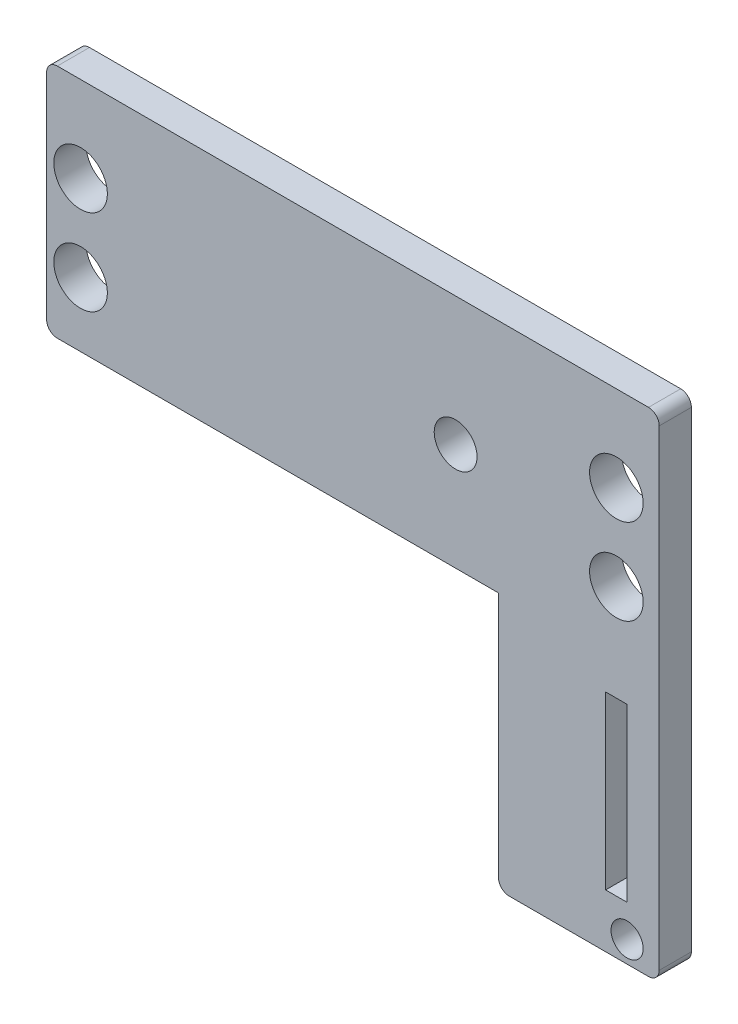
ISO-10303-21;
HEADER;
FILE_DESCRIPTION(('STEP AP214'),'2;1');
FILE_NAME('part.step','',(''),(''),'','','');
FILE_SCHEMA(('AUTOMOTIVE_DESIGN { 1 0 10303 214 1 1 1 1 }'));
ENDSEC;
DATA;
#1=APPLICATION_CONTEXT('core data for automotive mechanical design processes');
#2=APPLICATION_PROTOCOL_DEFINITION('international standard','automotive_design',2000,#1);
#3=PRODUCT_CONTEXT('',#1,'mechanical');
#4=PRODUCT('Part','Part','',(#3));
#5=PRODUCT_RELATED_PRODUCT_CATEGORY('part','',(#4));
#6=PRODUCT_DEFINITION_FORMATION('','',#4);
#7=PRODUCT_DEFINITION_CONTEXT('part definition',#1,'design');
#8=PRODUCT_DEFINITION('design','',#6,#7);
#9=PRODUCT_DEFINITION_SHAPE('','',#8);
#10=(LENGTH_UNIT() NAMED_UNIT(*) SI_UNIT(.MILLI.,.METRE.));
#11=(NAMED_UNIT(*) PLANE_ANGLE_UNIT() SI_UNIT($,.RADIAN.));
#12=(NAMED_UNIT(*) SI_UNIT($,.STERADIAN.) SOLID_ANGLE_UNIT());
#13=UNCERTAINTY_MEASURE_WITH_UNIT(LENGTH_MEASURE(1.E-05),#10,'distance_accuracy_value','');
#14=(GEOMETRIC_REPRESENTATION_CONTEXT(3) GLOBAL_UNCERTAINTY_ASSIGNED_CONTEXT((#13)) GLOBAL_UNIT_ASSIGNED_CONTEXT((#10,
#11,#12)) REPRESENTATION_CONTEXT('',''));
#15=CARTESIAN_POINT('',(0.,0.,0.));
#16=DIRECTION('',(0.,0.,1.));
#17=DIRECTION('',(1.,0.,0.));
#18=AXIS2_PLACEMENT_3D('',#15,#16,#17);
#19=CARTESIAN_POINT('',(1.,1.,0.));
#20=DIRECTION('',(0.,0.,1.));
#21=DIRECTION('',(1.,0.,0.));
#22=AXIS2_PLACEMENT_3D('',#19,#20,#21);
#23=CYLINDRICAL_SURFACE('',#22,1.);
#24=CARTESIAN_POINT('',(1.,1.,0.));
#25=DIRECTION('',(0.,0.,1.));
#26=DIRECTION('',(1.,0.,0.));
#27=AXIS2_PLACEMENT_3D('',#24,#25,#26);
#28=CIRCLE('',#27,1.);
#29=CARTESIAN_POINT('',(0.,1.,0.));
#30=VERTEX_POINT('',#29);
#31=CARTESIAN_POINT('',(1.,0.,0.));
#32=VERTEX_POINT('',#31);
#33=EDGE_CURVE('E265',#30,#32,#28,.T.);
#34=ORIENTED_EDGE('',*,*,#33,.T.);
#35=DIRECTION('',(0.,0.,-1.));
#36=VECTOR('',#35,1.);
#37=CARTESIAN_POINT('',(1.,0.,0.));
#38=LINE('',#37,#36);
#39=CARTESIAN_POINT('',(1.,0.,3.));
#40=VERTEX_POINT('',#39);
#41=EDGE_CURVE('E128',#40,#32,#38,.T.);
#42=ORIENTED_EDGE('',*,*,#41,.F.);
#43=CARTESIAN_POINT('',(1.,1.,3.));
#44=DIRECTION('',(0.,0.,1.));
#45=DIRECTION('',(1.,0.,0.));
#46=AXIS2_PLACEMENT_3D('',#43,#44,#45);
#47=CIRCLE('',#46,1.);
#48=CARTESIAN_POINT('',(0.,1.,3.));
#49=VERTEX_POINT('',#48);
#50=EDGE_CURVE('E20',#40,#49,#47,.F.);
#51=ORIENTED_EDGE('',*,*,#50,.T.);
#52=DIRECTION('',(0.,0.,1.));
#53=VECTOR('',#52,1.);
#54=CARTESIAN_POINT('',(0.,1.,0.));
#55=LINE('',#54,#53);
#56=EDGE_CURVE('E125',#30,#49,#55,.T.);
#57=ORIENTED_EDGE('',*,*,#56,.F.);
#58=EDGE_LOOP('',(#34,#42,#51,#57));
#59=FACE_BOUND('',#58,.T.);
#60=ADVANCED_FACE('F17',(#59),#23,.T.);
#61=CARTESIAN_POINT('',(14.,0.999999999999996,0.));
#62=DIRECTION('',(0.,0.,1.));
#63=DIRECTION('',(1.,0.,0.));
#64=AXIS2_PLACEMENT_3D('',#61,#62,#63);
#65=CYLINDRICAL_SURFACE('',#64,1.);
#66=CARTESIAN_POINT('',(14.,0.999999999999996,0.));
#67=DIRECTION('',(0.,0.,1.));
#68=DIRECTION('',(1.,0.,0.));
#69=AXIS2_PLACEMENT_3D('',#66,#67,#68);
#70=CIRCLE('',#69,1.);
#71=CARTESIAN_POINT('',(14.,0.,0.));
#72=VERTEX_POINT('',#71);
#73=CARTESIAN_POINT('',(15.,0.999999999999995,0.));
#74=VERTEX_POINT('',#73);
#75=EDGE_CURVE('E263',#72,#74,#70,.T.);
#76=ORIENTED_EDGE('',*,*,#75,.T.);
#77=DIRECTION('',(0.,0.,-1.));
#78=VECTOR('',#77,1.);
#79=CARTESIAN_POINT('',(15.,0.999999999999994,0.));
#80=LINE('',#79,#78);
#81=CARTESIAN_POINT('',(15.,0.999999999999995,3.));
#82=VERTEX_POINT('',#81);
#83=EDGE_CURVE('E194',#82,#74,#80,.T.);
#84=ORIENTED_EDGE('',*,*,#83,.F.);
#85=CARTESIAN_POINT('',(14.,0.999999999999996,3.));
#86=DIRECTION('',(0.,0.,1.));
#87=DIRECTION('',(1.,0.,0.));
#88=AXIS2_PLACEMENT_3D('',#85,#86,#87);
#89=CIRCLE('',#88,1.);
#90=CARTESIAN_POINT('',(14.,0.,3.));
#91=VERTEX_POINT('',#90);
#92=EDGE_CURVE('E130',#82,#91,#89,.F.);
#93=ORIENTED_EDGE('',*,*,#92,.T.);
#94=DIRECTION('',(0.,0.,-1.));
#95=VECTOR('',#94,1.);
#96=CARTESIAN_POINT('',(14.,0.,0.));
#97=LINE('',#96,#95);
#98=EDGE_CURVE('E202',#72,#91,#97,.F.);
#99=ORIENTED_EDGE('',*,*,#98,.F.);
#100=EDGE_LOOP('',(#76,#84,#93,#99));
#101=FACE_BOUND('',#100,.T.);
#102=ADVANCED_FACE('F274',(#101),#65,.T.);
#103=CARTESIAN_POINT('',(14.,45.,0.));
#104=DIRECTION('',(0.,0.,1.));
#105=DIRECTION('',(1.,0.,0.));
#106=AXIS2_PLACEMENT_3D('',#103,#104,#105);
#107=CYLINDRICAL_SURFACE('',#106,1.);
#108=CARTESIAN_POINT('',(14.,45.,0.));
#109=DIRECTION('',(0.,0.,1.));
#110=DIRECTION('',(1.,0.,0.));
#111=AXIS2_PLACEMENT_3D('',#108,#109,#110);
#112=CIRCLE('',#111,1.);
#113=CARTESIAN_POINT('',(15.,45.,0.));
#114=VERTEX_POINT('',#113);
#115=CARTESIAN_POINT('',(14.,46.,0.));
#116=VERTEX_POINT('',#115);
#117=EDGE_CURVE('E261',#114,#116,#112,.T.);
#118=ORIENTED_EDGE('',*,*,#117,.T.);
#119=DIRECTION('',(0.,0.,1.));
#120=VECTOR('',#119,1.);
#121=CARTESIAN_POINT('',(14.,46.,0.));
#122=LINE('',#121,#120);
#123=CARTESIAN_POINT('',(14.,46.,3.));
#124=VERTEX_POINT('',#123);
#125=EDGE_CURVE('E186',#124,#116,#122,.F.);
#126=ORIENTED_EDGE('',*,*,#125,.F.);
#127=CARTESIAN_POINT('',(14.,45.,3.));
#128=DIRECTION('',(0.,0.,1.));
#129=DIRECTION('',(1.,0.,0.));
#130=AXIS2_PLACEMENT_3D('',#127,#128,#129);
#131=CIRCLE('',#130,1.);
#132=CARTESIAN_POINT('',(15.,45.,3.));
#133=VERTEX_POINT('',#132);
#134=EDGE_CURVE('E271',#124,#133,#131,.F.);
#135=ORIENTED_EDGE('',*,*,#134,.T.);
#136=DIRECTION('',(0.,0.,-1.));
#137=VECTOR('',#136,1.);
#138=CARTESIAN_POINT('',(15.,45.,0.));
#139=LINE('',#138,#137);
#140=EDGE_CURVE('E197',#114,#133,#139,.F.);
#141=ORIENTED_EDGE('',*,*,#140,.F.);
#142=EDGE_LOOP('',(#118,#126,#135,#141));
#143=FACE_BOUND('',#142,.T.);
#144=ADVANCED_FACE('F392',(#143),#107,.T.);
#145=CARTESIAN_POINT('',(-41.1673508127766,45.,1.5));
#146=DIRECTION('',(0.,0.,1.));
#147=DIRECTION('',(1.,0.,0.));
#148=AXIS2_PLACEMENT_3D('',#145,#146,#147);
#149=CYLINDRICAL_SURFACE('',#148,1.);
#150=CARTESIAN_POINT('',(-41.1673508127766,45.,0.));
#151=DIRECTION('',(0.,0.,1.));
#152=DIRECTION('',(1.,0.,0.));
#153=AXIS2_PLACEMENT_3D('',#150,#151,#152);
#154=CIRCLE('',#153,1.);
#155=CARTESIAN_POINT('',(-41.1673508127766,46.,0.));
#156=VERTEX_POINT('',#155);
#157=CARTESIAN_POINT('',(-42.1673508127766,45.,0.));
#158=VERTEX_POINT('',#157);
#159=EDGE_CURVE('E259',#156,#158,#154,.T.);
#160=ORIENTED_EDGE('',*,*,#159,.T.);
#161=DIRECTION('',(0.,0.,-1.));
#162=VECTOR('',#161,1.);
#163=CARTESIAN_POINT('',(-42.1673508127766,45.,3.));
#164=LINE('',#163,#162);
#165=CARTESIAN_POINT('',(-42.1673508127766,45.,3.));
#166=VERTEX_POINT('',#165);
#167=EDGE_CURVE('E178',#158,#166,#164,.F.);
#168=ORIENTED_EDGE('',*,*,#167,.T.);
#169=CARTESIAN_POINT('',(-41.1673508127766,45.,3.));
#170=DIRECTION('',(0.,0.,1.));
#171=DIRECTION('',(1.,0.,0.));
#172=AXIS2_PLACEMENT_3D('',#169,#170,#171);
#173=CIRCLE('',#172,1.);
#174=CARTESIAN_POINT('',(-41.1673508127766,46.,3.));
#175=VERTEX_POINT('',#174);
#176=EDGE_CURVE('E269',#166,#175,#173,.F.);
#177=ORIENTED_EDGE('',*,*,#176,.T.);
#178=DIRECTION('',(0.,0.,1.));
#179=VECTOR('',#178,1.);
#180=CARTESIAN_POINT('',(-41.1673508127766,46.,0.));
#181=LINE('',#180,#179);
#182=EDGE_CURVE('E190',#156,#175,#181,.T.);
#183=ORIENTED_EDGE('',*,*,#182,.F.);
#184=EDGE_LOOP('',(#160,#168,#177,#183));
#185=FACE_BOUND('',#184,.T.);
#186=ADVANCED_FACE('F388',(#185),#149,.T.);
#187=CARTESIAN_POINT('',(-41.1673508127766,25.,1.5));
#188=DIRECTION('',(0.,0.,-1.));
#189=DIRECTION('',(-1.,0.,0.));
#190=AXIS2_PLACEMENT_3D('',#187,#188,#189);
#191=CYLINDRICAL_SURFACE('',#190,1.);
#192=CARTESIAN_POINT('',(-41.1673508127766,25.,3.));
#193=DIRECTION('',(0.,0.,-1.));
#194=DIRECTION('',(-1.,0.,0.));
#195=AXIS2_PLACEMENT_3D('',#192,#193,#194);
#196=CIRCLE('',#195,1.);
#197=CARTESIAN_POINT('',(-41.1673508127766,24.,3.));
#198=VERTEX_POINT('',#197);
#199=CARTESIAN_POINT('',(-42.1673508127766,25.,3.));
#200=VERTEX_POINT('',#199);
#201=EDGE_CURVE('E267',#198,#200,#196,.T.);
#202=ORIENTED_EDGE('',*,*,#201,.T.);
#203=DIRECTION('',(0.,0.,-1.));
#204=VECTOR('',#203,1.);
#205=CARTESIAN_POINT('',(-42.1673508127766,25.,3.));
#206=LINE('',#205,#204);
#207=CARTESIAN_POINT('',(-42.1673508127766,25.,0.));
#208=VERTEX_POINT('',#207);
#209=EDGE_CURVE('E181',#200,#208,#206,.T.);
#210=ORIENTED_EDGE('',*,*,#209,.T.);
#211=CARTESIAN_POINT('',(-41.1673508127766,25.,0.));
#212=DIRECTION('',(0.,0.,-1.));
#213=DIRECTION('',(-1.,0.,0.));
#214=AXIS2_PLACEMENT_3D('',#211,#212,#213);
#215=CIRCLE('',#214,1.);
#216=CARTESIAN_POINT('',(-41.1673508127766,24.,0.));
#217=VERTEX_POINT('',#216);
#218=EDGE_CURVE('E211',#208,#217,#215,.F.);
#219=ORIENTED_EDGE('',*,*,#218,.T.);
#220=DIRECTION('',(0.,0.,-1.));
#221=VECTOR('',#220,1.);
#222=CARTESIAN_POINT('',(-41.1673508127766,24.,0.));
#223=LINE('',#222,#221);
#224=EDGE_CURVE('E208',#198,#217,#223,.T.);
#225=ORIENTED_EDGE('',*,*,#224,.F.);
#226=EDGE_LOOP('',(#202,#210,#219,#225));
#227=FACE_BOUND('',#226,.T.);
#228=ADVANCED_FACE('F342',(#227),#191,.T.);
#229=CARTESIAN_POINT('',(-12.5357142857143,28.4642857142857,0.));
#230=DIRECTION('',(0.,0.,1.));
#231=DIRECTION('',(1.,0.,0.));
#232=AXIS2_PLACEMENT_3D('',#229,#230,#231);
#233=PLANE('',#232);
#234=CARTESIAN_POINT('',(12.,2.,0.));
#235=DIRECTION('',(0.,0.,-1.));
#236=DIRECTION('',(-1.,0.,0.));
#237=AXIS2_PLACEMENT_3D('',#234,#235,#236);
#238=CIRCLE('',#237,1.5);
#239=CARTESIAN_POINT('',(10.5,2.,0.));
#240=VERTEX_POINT('',#239);
#241=EDGE_CURVE('E150',#240,#240,#238,.F.);
#242=ORIENTED_EDGE('',*,*,#241,.T.);
#243=EDGE_LOOP('',(#242));
#244=FACE_BOUND('',#243,.T.);
#245=DIRECTION('',(0.,1.,0.));
#246=VECTOR('',#245,1.);
#247=CARTESIAN_POINT('',(10.,21.,0.));
#248=LINE('',#247,#246);
#249=CARTESIAN_POINT('',(10.,21.,0.));
#250=VERTEX_POINT('',#249);
#251=CARTESIAN_POINT('',(10.,5.,0.));
#252=VERTEX_POINT('',#251);
#253=EDGE_CURVE('E158',#250,#252,#248,.F.);
#254=ORIENTED_EDGE('',*,*,#253,.T.);
#255=DIRECTION('',(1.,0.,0.));
#256=VECTOR('',#255,1.);
#257=CARTESIAN_POINT('',(10.,5.,0.));
#258=LINE('',#257,#256);
#259=CARTESIAN_POINT('',(12.,5.,0.));
#260=VERTEX_POINT('',#259);
#261=EDGE_CURVE('E165',#252,#260,#258,.T.);
#262=ORIENTED_EDGE('',*,*,#261,.T.);
#263=DIRECTION('',(0.,1.,0.));
#264=VECTOR('',#263,1.);
#265=CARTESIAN_POINT('',(12.,5.,0.));
#266=LINE('',#265,#264);
#267=CARTESIAN_POINT('',(12.,21.,0.));
#268=VERTEX_POINT('',#267);
#269=EDGE_CURVE('E170',#260,#268,#266,.T.);
#270=ORIENTED_EDGE('',*,*,#269,.T.);
#271=DIRECTION('',(1.,0.,0.));
#272=VECTOR('',#271,1.);
#273=CARTESIAN_POINT('',(12.,21.,0.));
#274=LINE('',#273,#272);
#275=EDGE_CURVE('E175',#268,#250,#274,.F.);
#276=ORIENTED_EDGE('',*,*,#275,.T.);
#277=EDGE_LOOP('',(#254,#262,#270,#276));
#278=FACE_BOUND('',#277,.T.);
#279=CARTESIAN_POINT('',(-39.,30.,0.));
#280=DIRECTION('',(0.,0.,-1.));
#281=DIRECTION('',(-1.,0.,0.));
#282=AXIS2_PLACEMENT_3D('',#279,#280,#281);
#283=CIRCLE('',#282,2.5);
#284=CARTESIAN_POINT('',(-41.5,30.,0.));
#285=VERTEX_POINT('',#284);
#286=EDGE_CURVE('E177',#285,#285,#283,.F.);
#287=ORIENTED_EDGE('',*,*,#286,.T.);
#288=EDGE_LOOP('',(#287));
#289=FACE_BOUND('',#288,.T.);
#290=CARTESIAN_POINT('',(11.,30.,0.));
#291=DIRECTION('',(0.,0.,-1.));
#292=DIRECTION('',(-1.,0.,0.));
#293=AXIS2_PLACEMENT_3D('',#290,#291,#292);
#294=CIRCLE('',#293,2.5);
#295=CARTESIAN_POINT('',(8.49999999999999,30.,0.));
#296=VERTEX_POINT('',#295);
#297=EDGE_CURVE('E247',#296,#296,#294,.F.);
#298=ORIENTED_EDGE('',*,*,#297,.T.);
#299=EDGE_LOOP('',(#298));
#300=FACE_BOUND('',#299,.T.);
#301=CARTESIAN_POINT('',(-39.,38.0000000000001,0.));
#302=DIRECTION('',(0.,0.,-1.));
#303=DIRECTION('',(-1.,0.,0.));
#304=AXIS2_PLACEMENT_3D('',#301,#302,#303);
#305=CIRCLE('',#304,2.5);
#306=CARTESIAN_POINT('',(-41.5,38.0000000000001,0.));
#307=VERTEX_POINT('',#306);
#308=EDGE_CURVE('E250',#307,#307,#305,.F.);
#309=ORIENTED_EDGE('',*,*,#308,.T.);
#310=EDGE_LOOP('',(#309));
#311=FACE_BOUND('',#310,.T.);
#312=CARTESIAN_POINT('',(11.,38.,0.));
#313=DIRECTION('',(0.,0.,-1.));
#314=DIRECTION('',(-1.,0.,0.));
#315=AXIS2_PLACEMENT_3D('',#312,#313,#314);
#316=CIRCLE('',#315,2.5);
#317=CARTESIAN_POINT('',(8.49999999999996,38.,0.));
#318=VERTEX_POINT('',#317);
#319=EDGE_CURVE('E253',#318,#318,#316,.F.);
#320=ORIENTED_EDGE('',*,*,#319,.T.);
#321=EDGE_LOOP('',(#320));
#322=FACE_BOUND('',#321,.T.);
#323=CARTESIAN_POINT('',(-3.99999999999999,34.,0.));
#324=DIRECTION('',(0.,0.,-1.));
#325=DIRECTION('',(-1.,0.,0.));
#326=AXIS2_PLACEMENT_3D('',#323,#324,#325);
#327=CIRCLE('',#326,2.);
#328=CARTESIAN_POINT('',(-5.99999999999999,34.,0.));
#329=VERTEX_POINT('',#328);
#330=EDGE_CURVE('E185',#329,#329,#327,.F.);
#331=ORIENTED_EDGE('',*,*,#330,.T.);
#332=EDGE_LOOP('',(#331));
#333=FACE_BOUND('',#332,.T.);
#334=DIRECTION('',(0.,1.,0.));
#335=VECTOR('',#334,1.);
#336=CARTESIAN_POINT('',(-42.1673508127766,24.,0.));
#337=LINE('',#336,#335);
#338=EDGE_CURVE('E182',#208,#158,#337,.T.);
#339=ORIENTED_EDGE('',*,*,#338,.T.);
#340=ORIENTED_EDGE('',*,*,#159,.F.);
#341=DIRECTION('',(1.,0.,0.));
#342=VECTOR('',#341,1.);
#343=CARTESIAN_POINT('',(-20.,46.,0.));
#344=LINE('',#343,#342);
#345=EDGE_CURVE('E189',#116,#156,#344,.F.);
#346=ORIENTED_EDGE('',*,*,#345,.F.);
#347=ORIENTED_EDGE('',*,*,#117,.F.);
#348=DIRECTION('',(0.,1.,0.));
#349=VECTOR('',#348,1.);
#350=CARTESIAN_POINT('',(15.,46.,0.));
#351=LINE('',#350,#349);
#352=EDGE_CURVE('E193',#74,#114,#351,.T.);
#353=ORIENTED_EDGE('',*,*,#352,.F.);
#354=ORIENTED_EDGE('',*,*,#75,.F.);
#355=DIRECTION('',(1.,0.,0.));
#356=VECTOR('',#355,1.);
#357=CARTESIAN_POINT('',(15.,0.,0.));
#358=LINE('',#357,#356);
#359=EDGE_CURVE('E200',#32,#72,#358,.T.);
#360=ORIENTED_EDGE('',*,*,#359,.F.);
#361=ORIENTED_EDGE('',*,*,#33,.F.);
#362=DIRECTION('',(0.,1.,0.));
#363=VECTOR('',#362,1.);
#364=CARTESIAN_POINT('',(0.,0.,0.));
#365=LINE('',#364,#363);
#366=CARTESIAN_POINT('',(0.,24.,0.));
#367=VERTEX_POINT('',#366);
#368=EDGE_CURVE('E139',#367,#30,#365,.F.);
#369=ORIENTED_EDGE('',*,*,#368,.F.);
#370=DIRECTION('',(1.,0.,0.));
#371=VECTOR('',#370,1.);
#372=CARTESIAN_POINT('',(0.,24.,0.));
#373=LINE('',#372,#371);
#374=EDGE_CURVE('E141',#217,#367,#373,.T.);
#375=ORIENTED_EDGE('',*,*,#374,.F.);
#376=ORIENTED_EDGE('',*,*,#218,.F.);
#377=EDGE_LOOP('',(#339,#340,#346,#347,#353,#354,#360,#361,#369,#375,#376));
#378=FACE_BOUND('',#377,.T.);
#379=ADVANCED_FACE('F282',(#244,#278,#289,#300,#311,#322,#333,#378),#233,.F.);
#380=CARTESIAN_POINT('',(0.,24.,0.));
#381=DIRECTION('',(0.,-1.,0.));
#382=DIRECTION('',(0.,0.,-1.));
#383=AXIS2_PLACEMENT_3D('',#380,#381,#382);
#384=PLANE('',#383);
#385=DIRECTION('',(0.,0.,1.));
#386=VECTOR('',#385,1.);
#387=CARTESIAN_POINT('',(0.,24.,0.));
#388=LINE('',#387,#386);
#389=CARTESIAN_POINT('',(0.,24.,3.));
#390=VERTEX_POINT('',#389);
#391=EDGE_CURVE('E140',#390,#367,#388,.F.);
#392=ORIENTED_EDGE('',*,*,#391,.F.);
#393=DIRECTION('',(1.,0.,0.));
#394=VECTOR('',#393,1.);
#395=CARTESIAN_POINT('',(-12.5357142857143,24.,3.));
#396=LINE('',#395,#394);
#397=EDGE_CURVE('E145',#198,#390,#396,.T.);
#398=ORIENTED_EDGE('',*,*,#397,.F.);
#399=ORIENTED_EDGE('',*,*,#224,.T.);
#400=ORIENTED_EDGE('',*,*,#374,.T.);
#401=EDGE_LOOP('',(#392,#398,#399,#400));
#402=FACE_BOUND('',#401,.T.);
#403=ADVANCED_FACE('F341',(#402),#384,.T.);
#404=CARTESIAN_POINT('',(0.,0.,0.));
#405=DIRECTION('',(-1.,0.,0.));
#406=DIRECTION('',(0.,0.,1.));
#407=AXIS2_PLACEMENT_3D('',#404,#405,#406);
#408=PLANE('',#407);
#409=ORIENTED_EDGE('',*,*,#391,.T.);
#410=ORIENTED_EDGE('',*,*,#368,.T.);
#411=ORIENTED_EDGE('',*,*,#56,.T.);
#412=DIRECTION('',(0.,1.,0.));
#413=VECTOR('',#412,1.);
#414=CARTESIAN_POINT('',(0.,28.4642857142857,3.));
#415=LINE('',#414,#413);
#416=EDGE_CURVE('E136',#390,#49,#415,.F.);
#417=ORIENTED_EDGE('',*,*,#416,.F.);
#418=EDGE_LOOP('',(#409,#410,#411,#417));
#419=FACE_BOUND('',#418,.T.);
#420=ADVANCED_FACE('F135',(#419),#408,.T.);
#421=CARTESIAN_POINT('',(15.,0.,0.));
#422=DIRECTION('',(0.,-1.,0.));
#423=DIRECTION('',(0.,0.,-1.));
#424=AXIS2_PLACEMENT_3D('',#421,#422,#423);
#425=PLANE('',#424);
#426=ORIENTED_EDGE('',*,*,#41,.T.);
#427=ORIENTED_EDGE('',*,*,#359,.T.);
#428=ORIENTED_EDGE('',*,*,#98,.T.);
#429=DIRECTION('',(1.,0.,0.));
#430=VECTOR('',#429,1.);
#431=CARTESIAN_POINT('',(-12.5357142857143,0.,3.));
#432=LINE('',#431,#430);
#433=EDGE_CURVE('E146',#40,#91,#432,.T.);
#434=ORIENTED_EDGE('',*,*,#433,.F.);
#435=EDGE_LOOP('',(#426,#427,#428,#434));
#436=FACE_BOUND('',#435,.T.);
#437=ADVANCED_FACE('F279',(#436),#425,.T.);
#438=CARTESIAN_POINT('',(15.,46.,0.));
#439=DIRECTION('',(1.,0.,0.));
#440=DIRECTION('',(0.,0.,-1.));
#441=AXIS2_PLACEMENT_3D('',#438,#439,#440);
#442=PLANE('',#441);
#443=ORIENTED_EDGE('',*,*,#83,.T.);
#444=ORIENTED_EDGE('',*,*,#352,.T.);
#445=ORIENTED_EDGE('',*,*,#140,.T.);
#446=DIRECTION('',(0.,1.,0.));
#447=VECTOR('',#446,1.);
#448=CARTESIAN_POINT('',(15.,28.4642857142857,3.));
#449=LINE('',#448,#447);
#450=EDGE_CURVE('E148',#82,#133,#449,.T.);
#451=ORIENTED_EDGE('',*,*,#450,.F.);
#452=EDGE_LOOP('',(#443,#444,#445,#451));
#453=FACE_BOUND('',#452,.T.);
#454=ADVANCED_FACE('F287',(#453),#442,.T.);
#455=CARTESIAN_POINT('',(-20.,46.,0.));
#456=DIRECTION('',(0.,1.,0.));
#457=DIRECTION('',(0.,0.,1.));
#458=AXIS2_PLACEMENT_3D('',#455,#456,#457);
#459=PLANE('',#458);
#460=ORIENTED_EDGE('',*,*,#125,.T.);
#461=ORIENTED_EDGE('',*,*,#345,.T.);
#462=ORIENTED_EDGE('',*,*,#182,.T.);
#463=DIRECTION('',(1.,0.,0.));
#464=VECTOR('',#463,1.);
#465=CARTESIAN_POINT('',(-12.5357142857143,46.,3.));
#466=LINE('',#465,#464);
#467=EDGE_CURVE('E288',#124,#175,#466,.F.);
#468=ORIENTED_EDGE('',*,*,#467,.F.);
#469=EDGE_LOOP('',(#460,#461,#462,#468));
#470=FACE_BOUND('',#469,.T.);
#471=ADVANCED_FACE('F368',(#470),#459,.T.);
#472=CARTESIAN_POINT('',(-42.1673508127766,24.,3.));
#473=DIRECTION('',(1.,0.,0.));
#474=DIRECTION('',(0.,0.,-1.));
#475=AXIS2_PLACEMENT_3D('',#472,#473,#474);
#476=PLANE('',#475);
#477=DIRECTION('',(0.,1.,0.));
#478=VECTOR('',#477,1.);
#479=CARTESIAN_POINT('',(-42.1673508127766,28.4642857142857,3.));
#480=LINE('',#479,#478);
#481=EDGE_CURVE('E242',#166,#200,#480,.F.);
#482=ORIENTED_EDGE('',*,*,#481,.F.);
#483=ORIENTED_EDGE('',*,*,#167,.F.);
#484=ORIENTED_EDGE('',*,*,#338,.F.);
#485=ORIENTED_EDGE('',*,*,#209,.F.);
#486=EDGE_LOOP('',(#482,#483,#484,#485));
#487=FACE_BOUND('',#486,.T.);
#488=ADVANCED_FACE('F358',(#487),#476,.F.);
#489=CARTESIAN_POINT('',(-3.99999999999999,34.,3.));
#490=DIRECTION('',(0.,0.,-1.));
#491=DIRECTION('',(-1.,0.,0.));
#492=AXIS2_PLACEMENT_3D('',#489,#490,#491);
#493=CYLINDRICAL_SURFACE('',#492,2.);
#494=CARTESIAN_POINT('',(-3.99999999999999,34.,3.));
#495=DIRECTION('',(0.,0.,-1.));
#496=DIRECTION('',(-1.,0.,0.));
#497=AXIS2_PLACEMENT_3D('',#494,#495,#496);
#498=CIRCLE('',#497,2.);
#499=CARTESIAN_POINT('',(-5.99999999999999,34.,3.));
#500=VERTEX_POINT('',#499);
#501=EDGE_CURVE('E239',#500,#500,#498,.T.);
#502=ORIENTED_EDGE('',*,*,#501,.F.);
#503=EDGE_LOOP('',(#502));
#504=FACE_BOUND('',#503,.T.);
#505=ORIENTED_EDGE('',*,*,#330,.F.);
#506=EDGE_LOOP('',(#505));
#507=FACE_BOUND('',#506,.T.);
#508=ADVANCED_FACE('F355',(#504,#507),#493,.F.);
#509=CARTESIAN_POINT('',(11.,38.,3.));
#510=DIRECTION('',(0.,0.,-1.));
#511=DIRECTION('',(-1.,0.,0.));
#512=AXIS2_PLACEMENT_3D('',#509,#510,#511);
#513=CYLINDRICAL_SURFACE('',#512,2.5);
#514=CARTESIAN_POINT('',(11.,38.,3.));
#515=DIRECTION('',(0.,0.,-1.));
#516=DIRECTION('',(-1.,0.,0.));
#517=AXIS2_PLACEMENT_3D('',#514,#515,#516);
#518=CIRCLE('',#517,2.5);
#519=CARTESIAN_POINT('',(8.49999999999996,38.,3.));
#520=VERTEX_POINT('',#519);
#521=EDGE_CURVE('E236',#520,#520,#518,.T.);
#522=ORIENTED_EDGE('',*,*,#521,.F.);
#523=EDGE_LOOP('',(#522));
#524=FACE_BOUND('',#523,.T.);
#525=ORIENTED_EDGE('',*,*,#319,.F.);
#526=EDGE_LOOP('',(#525));
#527=FACE_BOUND('',#526,.T.);
#528=ADVANCED_FACE('F357',(#524,#527),#513,.F.);
#529=CARTESIAN_POINT('',(-39.,38.0000000000001,3.));
#530=DIRECTION('',(0.,0.,-1.));
#531=DIRECTION('',(-1.,0.,0.));
#532=AXIS2_PLACEMENT_3D('',#529,#530,#531);
#533=CYLINDRICAL_SURFACE('',#532,2.5);
#534=CARTESIAN_POINT('',(-39.,38.0000000000001,3.));
#535=DIRECTION('',(0.,0.,-1.));
#536=DIRECTION('',(-1.,0.,0.));
#537=AXIS2_PLACEMENT_3D('',#534,#535,#536);
#538=CIRCLE('',#537,2.5);
#539=CARTESIAN_POINT('',(-41.5,38.0000000000001,3.));
#540=VERTEX_POINT('',#539);
#541=EDGE_CURVE('E233',#540,#540,#538,.T.);
#542=ORIENTED_EDGE('',*,*,#541,.F.);
#543=EDGE_LOOP('',(#542));
#544=FACE_BOUND('',#543,.T.);
#545=ORIENTED_EDGE('',*,*,#308,.F.);
#546=EDGE_LOOP('',(#545));
#547=FACE_BOUND('',#546,.T.);
#548=ADVANCED_FACE('F365',(#544,#547),#533,.F.);
#549=CARTESIAN_POINT('',(11.,30.,3.));
#550=DIRECTION('',(0.,0.,-1.));
#551=DIRECTION('',(-1.,0.,0.));
#552=AXIS2_PLACEMENT_3D('',#549,#550,#551);
#553=CYLINDRICAL_SURFACE('',#552,2.5);
#554=CARTESIAN_POINT('',(11.,30.,3.));
#555=DIRECTION('',(0.,0.,-1.));
#556=DIRECTION('',(-1.,0.,0.));
#557=AXIS2_PLACEMENT_3D('',#554,#555,#556);
#558=CIRCLE('',#557,2.5);
#559=CARTESIAN_POINT('',(8.49999999999999,30.,3.));
#560=VERTEX_POINT('',#559);
#561=EDGE_CURVE('E230',#560,#560,#558,.T.);
#562=ORIENTED_EDGE('',*,*,#561,.F.);
#563=EDGE_LOOP('',(#562));
#564=FACE_BOUND('',#563,.T.);
#565=ORIENTED_EDGE('',*,*,#297,.F.);
#566=EDGE_LOOP('',(#565));
#567=FACE_BOUND('',#566,.T.);
#568=ADVANCED_FACE('F490',(#564,#567),#553,.F.);
#569=CARTESIAN_POINT('',(-39.,30.,3.));
#570=DIRECTION('',(0.,0.,-1.));
#571=DIRECTION('',(-1.,0.,0.));
#572=AXIS2_PLACEMENT_3D('',#569,#570,#571);
#573=CYLINDRICAL_SURFACE('',#572,2.5);
#574=CARTESIAN_POINT('',(-39.,30.,3.));
#575=DIRECTION('',(0.,0.,-1.));
#576=DIRECTION('',(-1.,0.,0.));
#577=AXIS2_PLACEMENT_3D('',#574,#575,#576);
#578=CIRCLE('',#577,2.5);
#579=CARTESIAN_POINT('',(-41.5,30.,3.));
#580=VERTEX_POINT('',#579);
#581=EDGE_CURVE('E226',#580,#580,#578,.T.);
#582=ORIENTED_EDGE('',*,*,#581,.F.);
#583=EDGE_LOOP('',(#582));
#584=FACE_BOUND('',#583,.T.);
#585=ORIENTED_EDGE('',*,*,#286,.F.);
#586=EDGE_LOOP('',(#585));
#587=FACE_BOUND('',#586,.T.);
#588=ADVANCED_FACE('F499',(#584,#587),#573,.F.);
#589=CARTESIAN_POINT('',(12.,21.,3.));
#590=DIRECTION('',(0.,1.,0.));
#591=DIRECTION('',(0.,0.,1.));
#592=AXIS2_PLACEMENT_3D('',#589,#590,#591);
#593=PLANE('',#592);
#594=DIRECTION('',(0.,0.,-1.));
#595=VECTOR('',#594,1.);
#596=CARTESIAN_POINT('',(12.,21.,3.));
#597=LINE('',#596,#595);
#598=CARTESIAN_POINT('',(12.,21.,3.));
#599=VERTEX_POINT('',#598);
#600=EDGE_CURVE('E173',#268,#599,#597,.F.);
#601=ORIENTED_EDGE('',*,*,#600,.T.);
#602=DIRECTION('',(1.,0.,0.));
#603=VECTOR('',#602,1.);
#604=CARTESIAN_POINT('',(-12.5357142857143,21.,3.));
#605=LINE('',#604,#603);
#606=CARTESIAN_POINT('',(10.,21.,3.));
#607=VERTEX_POINT('',#606);
#608=EDGE_CURVE('E229',#607,#599,#605,.T.);
#609=ORIENTED_EDGE('',*,*,#608,.F.);
#610=DIRECTION('',(0.,0.,1.));
#611=VECTOR('',#610,1.);
#612=CARTESIAN_POINT('',(10.,21.,3.));
#613=LINE('',#612,#611);
#614=EDGE_CURVE('E161',#607,#250,#613,.F.);
#615=ORIENTED_EDGE('',*,*,#614,.T.);
#616=ORIENTED_EDGE('',*,*,#275,.F.);
#617=EDGE_LOOP('',(#601,#609,#615,#616));
#618=FACE_BOUND('',#617,.T.);
#619=ADVANCED_FACE('F310',(#618),#593,.F.);
#620=CARTESIAN_POINT('',(12.,5.,3.));
#621=DIRECTION('',(1.,0.,0.));
#622=DIRECTION('',(0.,0.,-1.));
#623=AXIS2_PLACEMENT_3D('',#620,#621,#622);
#624=PLANE('',#623);
#625=DIRECTION('',(0.,0.,-1.));
#626=VECTOR('',#625,1.);
#627=CARTESIAN_POINT('',(12.,5.,3.));
#628=LINE('',#627,#626);
#629=CARTESIAN_POINT('',(12.,5.,3.));
#630=VERTEX_POINT('',#629);
#631=EDGE_CURVE('E168',#260,#630,#628,.F.);
#632=ORIENTED_EDGE('',*,*,#631,.T.);
#633=DIRECTION('',(0.,1.,0.));
#634=VECTOR('',#633,1.);
#635=CARTESIAN_POINT('',(12.,28.4642857142857,3.));
#636=LINE('',#635,#634);
#637=EDGE_CURVE('E296',#599,#630,#636,.F.);
#638=ORIENTED_EDGE('',*,*,#637,.F.);
#639=ORIENTED_EDGE('',*,*,#600,.F.);
#640=ORIENTED_EDGE('',*,*,#269,.F.);
#641=EDGE_LOOP('',(#632,#638,#639,#640));
#642=FACE_BOUND('',#641,.T.);
#643=ADVANCED_FACE('F314',(#642),#624,.F.);
#644=CARTESIAN_POINT('',(10.,5.,3.));
#645=DIRECTION('',(0.,-1.,0.));
#646=DIRECTION('',(0.,0.,-1.));
#647=AXIS2_PLACEMENT_3D('',#644,#645,#646);
#648=PLANE('',#647);
#649=DIRECTION('',(0.,0.,1.));
#650=VECTOR('',#649,1.);
#651=CARTESIAN_POINT('',(10.,5.,3.));
#652=LINE('',#651,#650);
#653=CARTESIAN_POINT('',(10.,5.,3.));
#654=VERTEX_POINT('',#653);
#655=EDGE_CURVE('E35',#252,#654,#652,.T.);
#656=ORIENTED_EDGE('',*,*,#655,.T.);
#657=DIRECTION('',(1.,0.,0.));
#658=VECTOR('',#657,1.);
#659=CARTESIAN_POINT('',(-12.5357142857143,5.,3.));
#660=LINE('',#659,#658);
#661=EDGE_CURVE('E299',#630,#654,#660,.F.);
#662=ORIENTED_EDGE('',*,*,#661,.F.);
#663=ORIENTED_EDGE('',*,*,#631,.F.);
#664=ORIENTED_EDGE('',*,*,#261,.F.);
#665=EDGE_LOOP('',(#656,#662,#663,#664));
#666=FACE_BOUND('',#665,.T.);
#667=ADVANCED_FACE('F316',(#666),#648,.F.);
#668=CARTESIAN_POINT('',(10.,21.,3.));
#669=DIRECTION('',(-1.,0.,0.));
#670=DIRECTION('',(0.,0.,1.));
#671=AXIS2_PLACEMENT_3D('',#668,#669,#670);
#672=PLANE('',#671);
#673=ORIENTED_EDGE('',*,*,#614,.F.);
#674=DIRECTION('',(0.,1.,0.));
#675=VECTOR('',#674,1.);
#676=CARTESIAN_POINT('',(10.,28.4642857142857,3.));
#677=LINE('',#676,#675);
#678=EDGE_CURVE('E26',#654,#607,#677,.T.);
#679=ORIENTED_EDGE('',*,*,#678,.F.);
#680=ORIENTED_EDGE('',*,*,#655,.F.);
#681=ORIENTED_EDGE('',*,*,#253,.F.);
#682=EDGE_LOOP('',(#673,#679,#680,#681));
#683=FACE_BOUND('',#682,.T.);
#684=ADVANCED_FACE('F307',(#683),#672,.F.);
#685=CARTESIAN_POINT('',(12.,2.,3.));
#686=DIRECTION('',(0.,0.,-1.));
#687=DIRECTION('',(-1.,0.,0.));
#688=AXIS2_PLACEMENT_3D('',#685,#686,#687);
#689=CYLINDRICAL_SURFACE('',#688,1.5);
#690=CARTESIAN_POINT('',(12.,2.,3.));
#691=DIRECTION('',(0.,0.,-1.));
#692=DIRECTION('',(-1.,0.,0.));
#693=AXIS2_PLACEMENT_3D('',#690,#691,#692);
#694=CIRCLE('',#693,1.5);
#695=CARTESIAN_POINT('',(10.5,2.,3.));
#696=VERTEX_POINT('',#695);
#697=EDGE_CURVE('E11',#696,#696,#694,.T.);
#698=ORIENTED_EDGE('',*,*,#697,.F.);
#699=EDGE_LOOP('',(#698));
#700=FACE_BOUND('',#699,.T.);
#701=ORIENTED_EDGE('',*,*,#241,.F.);
#702=EDGE_LOOP('',(#701));
#703=FACE_BOUND('',#702,.T.);
#704=ADVANCED_FACE('F324',(#700,#703),#689,.F.);
#705=CARTESIAN_POINT('',(-12.5357142857143,28.4642857142857,3.));
#706=DIRECTION('',(0.,0.,1.));
#707=DIRECTION('',(1.,0.,0.));
#708=AXIS2_PLACEMENT_3D('',#705,#706,#707);
#709=PLANE('',#708);
#710=ORIENTED_EDGE('',*,*,#697,.T.);
#711=EDGE_LOOP('',(#710));
#712=FACE_BOUND('',#711,.T.);
#713=ORIENTED_EDGE('',*,*,#661,.T.);
#714=ORIENTED_EDGE('',*,*,#678,.T.);
#715=ORIENTED_EDGE('',*,*,#608,.T.);
#716=ORIENTED_EDGE('',*,*,#637,.T.);
#717=EDGE_LOOP('',(#713,#714,#715,#716));
#718=FACE_BOUND('',#717,.T.);
#719=ORIENTED_EDGE('',*,*,#581,.T.);
#720=EDGE_LOOP('',(#719));
#721=FACE_BOUND('',#720,.T.);
#722=ORIENTED_EDGE('',*,*,#561,.T.);
#723=EDGE_LOOP('',(#722));
#724=FACE_BOUND('',#723,.T.);
#725=ORIENTED_EDGE('',*,*,#541,.T.);
#726=EDGE_LOOP('',(#725));
#727=FACE_BOUND('',#726,.T.);
#728=ORIENTED_EDGE('',*,*,#521,.T.);
#729=EDGE_LOOP('',(#728));
#730=FACE_BOUND('',#729,.T.);
#731=ORIENTED_EDGE('',*,*,#501,.T.);
#732=EDGE_LOOP('',(#731));
#733=FACE_BOUND('',#732,.T.);
#734=ORIENTED_EDGE('',*,*,#176,.F.);
#735=ORIENTED_EDGE('',*,*,#481,.T.);
#736=ORIENTED_EDGE('',*,*,#201,.F.);
#737=ORIENTED_EDGE('',*,*,#397,.T.);
#738=ORIENTED_EDGE('',*,*,#416,.T.);
#739=ORIENTED_EDGE('',*,*,#50,.F.);
#740=ORIENTED_EDGE('',*,*,#433,.T.);
#741=ORIENTED_EDGE('',*,*,#92,.F.);
#742=ORIENTED_EDGE('',*,*,#450,.T.);
#743=ORIENTED_EDGE('',*,*,#134,.F.);
#744=ORIENTED_EDGE('',*,*,#467,.T.);
#745=EDGE_LOOP('',(#734,#735,#736,#737,#738,#739,#740,#741,#742,#743,#744));
#746=FACE_BOUND('',#745,.T.);
#747=ADVANCED_FACE('F143',(#712,#718,#721,#724,#727,#730,#733,#746),#709,.T.);
#748=CLOSED_SHELL('',(#60,#102,#144,#186,#228,#379,#403,#420,#437,#454,#471,#488,#508,#528,#548,
#568,#588,#619,#643,#667,#684,#704,#747));
#749=MANIFOLD_SOLID_BREP('B1',#748);
#750=ADVANCED_BREP_SHAPE_REPRESENTATION('',(#18,#749),#14);
#751=SHAPE_DEFINITION_REPRESENTATION(#9,#750);
ENDSEC;
END-ISO-10303-21;
